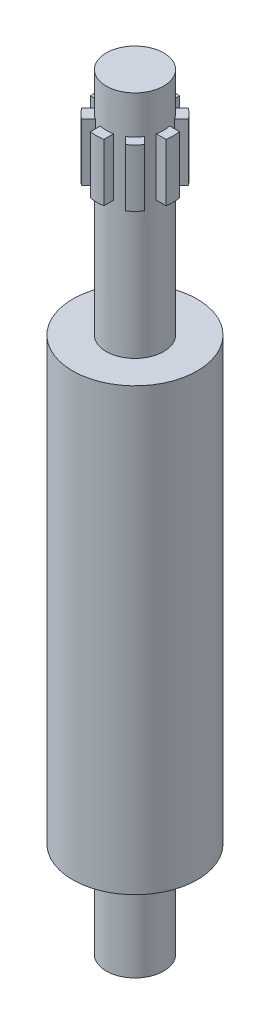
ISO-10303-21;
HEADER;
FILE_DESCRIPTION(('STEP AP214'),'2;1');
FILE_NAME('part.step','',(''),(''),'','','');
FILE_SCHEMA(('AUTOMOTIVE_DESIGN { 1 0 10303 214 1 1 1 1 }'));
ENDSEC;
DATA;
#1=APPLICATION_CONTEXT('core data for automotive mechanical design processes');
#2=APPLICATION_PROTOCOL_DEFINITION('international standard','automotive_design',2000,#1);
#3=PRODUCT_CONTEXT('',#1,'mechanical');
#4=PRODUCT('Part','Part','',(#3));
#5=PRODUCT_RELATED_PRODUCT_CATEGORY('part','',(#4));
#6=PRODUCT_DEFINITION_FORMATION('','',#4);
#7=PRODUCT_DEFINITION_CONTEXT('part definition',#1,'design');
#8=PRODUCT_DEFINITION('design','',#6,#7);
#9=PRODUCT_DEFINITION_SHAPE('','',#8);
#10=(LENGTH_UNIT() NAMED_UNIT(*) SI_UNIT(.MILLI.,.METRE.));
#11=(NAMED_UNIT(*) PLANE_ANGLE_UNIT() SI_UNIT($,.RADIAN.));
#12=(NAMED_UNIT(*) SI_UNIT($,.STERADIAN.) SOLID_ANGLE_UNIT());
#13=UNCERTAINTY_MEASURE_WITH_UNIT(LENGTH_MEASURE(1.E-05),#10,'distance_accuracy_value','');
#14=(GEOMETRIC_REPRESENTATION_CONTEXT(3) GLOBAL_UNCERTAINTY_ASSIGNED_CONTEXT((#13)) GLOBAL_UNIT_ASSIGNED_CONTEXT((#10,
#11,#12)) REPRESENTATION_CONTEXT('',''));
#15=CARTESIAN_POINT('',(0.,0.,0.));
#16=DIRECTION('',(0.,0.,1.));
#17=DIRECTION('',(1.,0.,0.));
#18=AXIS2_PLACEMENT_3D('',#15,#16,#17);
#19=CARTESIAN_POINT('',(0.,330.,0.));
#20=DIRECTION('',(0.,1.,0.));
#21=DIRECTION('',(0.,0.,1.));
#22=AXIS2_PLACEMENT_3D('',#19,#20,#21);
#23=PLANE('',#22);
#24=DIRECTION('',(0.707106781186547,0.,-0.707106781186548));
#25=VECTOR('',#24,1.);
#26=CARTESIAN_POINT('',(-11.4490265814913,330.,16.3987740497974));
#27=LINE('',#26,#25);
#28=CARTESIAN_POINT('',(-11.4490265814913,330.,16.3987740497974));
#29=VERTEX_POINT('',#28);
#30=CARTESIAN_POINT('',(-7.83895193821507,330.,12.7886994065211));
#31=VERTEX_POINT('',#30);
#32=EDGE_CURVE('E623',#29,#31,#27,.T.);
#33=ORIENTED_EDGE('',*,*,#32,.T.);
#34=CARTESIAN_POINT('',(0.,330.,0.));
#35=DIRECTION('',(0.,1.,0.));
#36=DIRECTION('',(0.,0.,1.));
#37=AXIS2_PLACEMENT_3D('',#34,#35,#36);
#38=CIRCLE('',#37,15.);
#39=CARTESIAN_POINT('',(-12.788699406521,330.,7.83895193821537));
#40=VERTEX_POINT('',#39);
#41=EDGE_CURVE('E462',#40,#31,#38,.T.);
#42=ORIENTED_EDGE('',*,*,#41,.F.);
#43=DIRECTION('',(-0.707106781186547,0.,0.707106781186548));
#44=VECTOR('',#43,1.);
#45=CARTESIAN_POINT('',(-12.788699406521,330.,7.83895193821539));
#46=LINE('',#45,#44);
#47=CARTESIAN_POINT('',(-16.3987740497972,330.,11.4490265814916));
#48=VERTEX_POINT('',#47);
#49=EDGE_CURVE('E615',#40,#48,#46,.T.);
#50=ORIENTED_EDGE('',*,*,#49,.T.);
#51=CARTESIAN_POINT('',(0.,330.,0.));
#52=DIRECTION('',(0.,1.,0.));
#53=DIRECTION('',(0.,0.,1.));
#54=AXIS2_PLACEMENT_3D('',#51,#52,#53);
#55=CIRCLE('',#54,20.);
#56=EDGE_CURVE('E619',#48,#29,#55,.T.);
#57=ORIENTED_EDGE('',*,*,#56,.T.);
#58=EDGE_LOOP('',(#33,#42,#50,#57));
#59=FACE_BOUND('',#58,.T.);
#60=ADVANCED_FACE('F43',(#59),#23,.T.);
#61=DIRECTION('',(1.,0.,0.));
#62=VECTOR('',#61,1.);
#63=CARTESIAN_POINT('',(-19.6913686675152,330.,3.50000000000016));
#64=LINE('',#63,#62);
#65=CARTESIAN_POINT('',(-19.6913686675152,330.,3.50000000000015));
#66=VERTEX_POINT('',#65);
#67=CARTESIAN_POINT('',(-14.5859521458148,330.,3.50000000000016));
#68=VERTEX_POINT('',#67);
#69=EDGE_CURVE('E612',#66,#68,#64,.T.);
#70=ORIENTED_EDGE('',*,*,#69,.T.);
#71=CARTESIAN_POINT('',(-14.5859521458149,330.,-3.49999999999984));
#72=VERTEX_POINT('',#71);
#73=EDGE_CURVE('E467',#72,#68,#38,.T.);
#74=ORIENTED_EDGE('',*,*,#73,.F.);
#75=DIRECTION('',(-1.,0.,0.));
#76=VECTOR('',#75,1.);
#77=CARTESIAN_POINT('',(-14.5859521458149,330.,-3.49999999999984));
#78=LINE('',#77,#76);
#79=CARTESIAN_POINT('',(-19.6913686675152,330.,-3.5));
#80=VERTEX_POINT('',#79);
#81=EDGE_CURVE('E604',#72,#80,#78,.T.);
#82=ORIENTED_EDGE('',*,*,#81,.T.);
#83=CARTESIAN_POINT('',(0.,330.,0.));
#84=DIRECTION('',(0.,1.,0.));
#85=DIRECTION('',(0.,0.,1.));
#86=AXIS2_PLACEMENT_3D('',#83,#84,#85);
#87=CIRCLE('',#86,20.);
#88=EDGE_CURVE('E608',#80,#66,#87,.T.);
#89=ORIENTED_EDGE('',*,*,#88,.T.);
#90=EDGE_LOOP('',(#70,#74,#82,#89));
#91=FACE_BOUND('',#90,.T.);
#92=ADVANCED_FACE('F391',(#91),#23,.T.);
#93=DIRECTION('',(0.707106781186548,0.,0.707106781186547));
#94=VECTOR('',#93,1.);
#95=CARTESIAN_POINT('',(-16.3987740497973,330.,-11.4490265814913));
#96=LINE('',#95,#94);
#97=CARTESIAN_POINT('',(-16.3987740497973,330.,-11.4490265814913));
#98=VERTEX_POINT('',#97);
#99=CARTESIAN_POINT('',(-12.7886994065211,330.,-7.83895193821511));
#100=VERTEX_POINT('',#99);
#101=EDGE_CURVE('E601',#98,#100,#96,.T.);
#102=ORIENTED_EDGE('',*,*,#101,.T.);
#103=CARTESIAN_POINT('',(-7.83895193821533,330.,-12.788699406521));
#104=VERTEX_POINT('',#103);
#105=EDGE_CURVE('E473',#104,#100,#38,.T.);
#106=ORIENTED_EDGE('',*,*,#105,.F.);
#107=DIRECTION('',(-0.707106781186548,0.,-0.707106781186547));
#108=VECTOR('',#107,1.);
#109=CARTESIAN_POINT('',(-7.83895193821531,330.,-12.788699406521));
#110=LINE('',#109,#108);
#111=CARTESIAN_POINT('',(-11.4490265814915,330.,-16.3987740497971));
#112=VERTEX_POINT('',#111);
#113=EDGE_CURVE('E505',#104,#112,#110,.T.);
#114=ORIENTED_EDGE('',*,*,#113,.T.);
#115=CARTESIAN_POINT('',(0.,330.,0.));
#116=DIRECTION('',(0.,1.,0.));
#117=DIRECTION('',(0.,0.,1.));
#118=AXIS2_PLACEMENT_3D('',#115,#116,#117);
#119=CIRCLE('',#118,20.);
#120=EDGE_CURVE('E597',#112,#98,#119,.T.);
#121=ORIENTED_EDGE('',*,*,#120,.T.);
#122=EDGE_LOOP('',(#102,#106,#114,#121));
#123=FACE_BOUND('',#122,.T.);
#124=ADVANCED_FACE('F397',(#123),#23,.T.);
#125=DIRECTION('',(0.,0.,1.));
#126=VECTOR('',#125,1.);
#127=CARTESIAN_POINT('',(-3.5,330.,-19.6913686675152));
#128=LINE('',#127,#126);
#129=CARTESIAN_POINT('',(-3.5,330.,-19.6913686675152));
#130=VERTEX_POINT('',#129);
#131=CARTESIAN_POINT('',(-3.5,330.,-14.5859521458148));
#132=VERTEX_POINT('',#131);
#133=EDGE_CURVE('E502',#130,#132,#128,.T.);
#134=ORIENTED_EDGE('',*,*,#133,.T.);
#135=CARTESIAN_POINT('',(3.5,330.,-14.5859521458148));
#136=VERTEX_POINT('',#135);
#137=EDGE_CURVE('E481',#136,#132,#38,.T.);
#138=ORIENTED_EDGE('',*,*,#137,.F.);
#139=DIRECTION('',(0.,0.,-1.));
#140=VECTOR('',#139,1.);
#141=CARTESIAN_POINT('',(3.5,330.,-14.5859521458148));
#142=LINE('',#141,#140);
#143=CARTESIAN_POINT('',(3.5,330.,-19.6913686675152));
#144=VERTEX_POINT('',#143);
#145=EDGE_CURVE('E519',#136,#144,#142,.T.);
#146=ORIENTED_EDGE('',*,*,#145,.T.);
#147=CARTESIAN_POINT('',(0.,330.,0.));
#148=DIRECTION('',(0.,1.,0.));
#149=DIRECTION('',(0.,0.,1.));
#150=AXIS2_PLACEMENT_3D('',#147,#148,#149);
#151=CIRCLE('',#150,20.);
#152=EDGE_CURVE('E456',#144,#130,#151,.T.);
#153=ORIENTED_EDGE('',*,*,#152,.T.);
#154=EDGE_LOOP('',(#134,#138,#146,#153));
#155=FACE_BOUND('',#154,.T.);
#156=ADVANCED_FACE('F503',(#155),#23,.T.);
#157=DIRECTION('',(-0.707106781186547,0.,0.707106781186547));
#158=VECTOR('',#157,1.);
#159=CARTESIAN_POINT('',(11.4490265814914,330.,-16.3987740497973));
#160=LINE('',#159,#158);
#161=CARTESIAN_POINT('',(11.4490265814914,330.,-16.3987740497973));
#162=VERTEX_POINT('',#161);
#163=CARTESIAN_POINT('',(7.83895193821517,330.,-12.7886994065211));
#164=VERTEX_POINT('',#163);
#165=EDGE_CURVE('E661',#162,#164,#160,.T.);
#166=ORIENTED_EDGE('',*,*,#165,.T.);
#167=CARTESIAN_POINT('',(12.788699406521,330.,-7.83895193821526));
#168=VERTEX_POINT('',#167);
#169=EDGE_CURVE('E247',#168,#164,#38,.T.);
#170=ORIENTED_EDGE('',*,*,#169,.F.);
#171=DIRECTION('',(0.707106781186548,0.,-0.707106781186548));
#172=VECTOR('',#171,1.);
#173=CARTESIAN_POINT('',(12.7886994065211,330.,-7.8389519382153));
#174=LINE('',#173,#172);
#175=CARTESIAN_POINT('',(16.3987740497972,330.,-11.4490265814915));
#176=VERTEX_POINT('',#175);
#177=EDGE_CURVE('E653',#168,#176,#174,.T.);
#178=ORIENTED_EDGE('',*,*,#177,.T.);
#179=CARTESIAN_POINT('',(0.,330.,0.));
#180=DIRECTION('',(0.,1.,0.));
#181=DIRECTION('',(0.,0.,1.));
#182=AXIS2_PLACEMENT_3D('',#179,#180,#181);
#183=CIRCLE('',#182,20.);
#184=EDGE_CURVE('E657',#176,#162,#183,.T.);
#185=ORIENTED_EDGE('',*,*,#184,.T.);
#186=EDGE_LOOP('',(#166,#170,#178,#185));
#187=FACE_BOUND('',#186,.T.);
#188=ADVANCED_FACE('F419',(#187),#23,.T.);
#189=DIRECTION('',(-1.,0.,0.));
#190=VECTOR('',#189,1.);
#191=CARTESIAN_POINT('',(19.6913686675153,330.,-3.50000000000006));
#192=LINE('',#191,#190);
#193=CARTESIAN_POINT('',(19.6913686675153,330.,-3.50000000000006));
#194=VERTEX_POINT('',#193);
#195=CARTESIAN_POINT('',(14.5859521458148,330.,-3.50000000000006));
#196=VERTEX_POINT('',#195);
#197=EDGE_CURVE('E649',#194,#196,#192,.T.);
#198=ORIENTED_EDGE('',*,*,#197,.T.);
#199=CARTESIAN_POINT('',(14.5859521458148,330.,3.49999999999994));
#200=VERTEX_POINT('',#199);
#201=EDGE_CURVE('E450',#200,#196,#38,.T.);
#202=ORIENTED_EDGE('',*,*,#201,.F.);
#203=DIRECTION('',(1.,0.,0.));
#204=VECTOR('',#203,1.);
#205=CARTESIAN_POINT('',(14.5859521458149,330.,3.49999999999994));
#206=LINE('',#205,#204);
#207=CARTESIAN_POINT('',(19.6913686675153,330.,3.49999999999994));
#208=VERTEX_POINT('',#207);
#209=EDGE_CURVE('E438',#200,#208,#206,.T.);
#210=ORIENTED_EDGE('',*,*,#209,.T.);
#211=CARTESIAN_POINT('',(0.,330.,0.));
#212=DIRECTION('',(0.,1.,0.));
#213=DIRECTION('',(0.,0.,1.));
#214=AXIS2_PLACEMENT_3D('',#211,#212,#213);
#215=CIRCLE('',#214,20.0000000000001);
#216=EDGE_CURVE('E645',#208,#194,#215,.T.);
#217=ORIENTED_EDGE('',*,*,#216,.T.);
#218=EDGE_LOOP('',(#198,#202,#210,#217));
#219=FACE_BOUND('',#218,.T.);
#220=ADVANCED_FACE('F412',(#219),#23,.T.);
#221=DIRECTION('',(-0.707106781186547,0.,-0.707106781186548));
#222=VECTOR('',#221,1.);
#223=CARTESIAN_POINT('',(16.3987740497974,330.,11.4490265814914));
#224=LINE('',#223,#222);
#225=CARTESIAN_POINT('',(16.3987740497974,330.,11.4490265814914));
#226=VERTEX_POINT('',#225);
#227=CARTESIAN_POINT('',(12.7886994065211,330.,7.83895193821513));
#228=VERTEX_POINT('',#227);
#229=EDGE_CURVE('E426',#226,#228,#224,.T.);
#230=ORIENTED_EDGE('',*,*,#229,.T.);
#231=CARTESIAN_POINT('',(7.83895193821531,330.,12.788699406521));
#232=VERTEX_POINT('',#231);
#233=EDGE_CURVE('E430',#232,#228,#38,.T.);
#234=ORIENTED_EDGE('',*,*,#233,.F.);
#235=DIRECTION('',(0.707106781186547,0.,0.707106781186547));
#236=VECTOR('',#235,1.);
#237=CARTESIAN_POINT('',(7.83895193821538,330.,12.7886994065211));
#238=LINE('',#237,#236);
#239=CARTESIAN_POINT('',(11.4490265814915,330.,16.3987740497972));
#240=VERTEX_POINT('',#239);
#241=EDGE_CURVE('E637',#232,#240,#238,.T.);
#242=ORIENTED_EDGE('',*,*,#241,.T.);
#243=CARTESIAN_POINT('',(0.,330.,0.));
#244=DIRECTION('',(0.,1.,0.));
#245=DIRECTION('',(0.,0.,1.));
#246=AXIS2_PLACEMENT_3D('',#243,#244,#245);
#247=CIRCLE('',#246,20.0000000000001);
#248=EDGE_CURVE('E433',#240,#226,#247,.T.);
#249=ORIENTED_EDGE('',*,*,#248,.T.);
#250=EDGE_LOOP('',(#230,#234,#242,#249));
#251=FACE_BOUND('',#250,.T.);
#252=ADVANCED_FACE('F404',(#251),#23,.T.);
#253=CARTESIAN_POINT('',(0.,230.,0.));
#254=DIRECTION('',(0.,-1.,0.));
#255=DIRECTION('',(0.,0.,-1.));
#256=AXIS2_PLACEMENT_3D('',#253,#254,#255);
#257=CYLINDRICAL_SURFACE('',#256,32.5);
#258=CARTESIAN_POINT('',(0.,230.,0.));
#259=DIRECTION('',(0.,1.,0.));
#260=DIRECTION('',(0.,0.,1.));
#261=AXIS2_PLACEMENT_3D('',#258,#259,#260);
#262=CIRCLE('',#261,32.5);
#263=CARTESIAN_POINT('',(0.,230.,32.5));
#264=VERTEX_POINT('',#263);
#265=EDGE_CURVE('E368',#264,#264,#262,.T.);
#266=ORIENTED_EDGE('',*,*,#265,.F.);
#267=EDGE_LOOP('',(#266));
#268=FACE_BOUND('',#267,.T.);
#269=CARTESIAN_POINT('',(0.,0.,0.));
#270=DIRECTION('',(0.,1.,0.));
#271=DIRECTION('',(0.,0.,1.));
#272=AXIS2_PLACEMENT_3D('',#269,#270,#271);
#273=CIRCLE('',#272,32.5);
#274=CARTESIAN_POINT('',(0.,0.,32.5));
#275=VERTEX_POINT('',#274);
#276=EDGE_CURVE('E359',#275,#275,#273,.T.);
#277=ORIENTED_EDGE('',*,*,#276,.T.);
#278=EDGE_LOOP('',(#277));
#279=FACE_BOUND('',#278,.T.);
#280=ADVANCED_FACE('F45',(#268,#279),#257,.T.);
#281=CARTESIAN_POINT('',(0.,230.,0.));
#282=DIRECTION('',(0.,1.,0.));
#283=DIRECTION('',(0.,0.,1.));
#284=AXIS2_PLACEMENT_3D('',#281,#282,#283);
#285=PLANE('',#284);
#286=CARTESIAN_POINT('',(0.,230.,0.));
#287=DIRECTION('',(0.,1.,0.));
#288=DIRECTION('',(0.,0.,1.));
#289=AXIS2_PLACEMENT_3D('',#286,#287,#288);
#290=CIRCLE('',#289,15.);
#291=CARTESIAN_POINT('',(0.,230.,15.));
#292=VERTEX_POINT('',#291);
#293=EDGE_CURVE('E364',#292,#292,#290,.T.);
#294=ORIENTED_EDGE('',*,*,#293,.F.);
#295=EDGE_LOOP('',(#294));
#296=FACE_BOUND('',#295,.T.);
#297=ORIENTED_EDGE('',*,*,#265,.T.);
#298=EDGE_LOOP('',(#297));
#299=FACE_BOUND('',#298,.T.);
#300=ADVANCED_FACE('F378',(#296,#299),#285,.T.);
#301=CARTESIAN_POINT('',(0.,0.,0.));
#302=DIRECTION('',(0.,1.,0.));
#303=DIRECTION('',(0.,0.,1.));
#304=AXIS2_PLACEMENT_3D('',#301,#302,#303);
#305=PLANE('',#304);
#306=CARTESIAN_POINT('',(0.,0.,0.));
#307=DIRECTION('',(0.,-1.,0.));
#308=DIRECTION('',(0.,0.,-1.));
#309=AXIS2_PLACEMENT_3D('',#306,#307,#308);
#310=CIRCLE('',#309,15.);
#311=CARTESIAN_POINT('',(0.,0.,-15.));
#312=VERTEX_POINT('',#311);
#313=EDGE_CURVE('E360',#312,#312,#310,.T.);
#314=ORIENTED_EDGE('',*,*,#313,.F.);
#315=EDGE_LOOP('',(#314));
#316=FACE_BOUND('',#315,.T.);
#317=ORIENTED_EDGE('',*,*,#276,.F.);
#318=EDGE_LOOP('',(#317));
#319=FACE_BOUND('',#318,.T.);
#320=ADVANCED_FACE('F376',(#316,#319),#305,.F.);
#321=CARTESIAN_POINT('',(0.,330.,0.));
#322=DIRECTION('',(0.,-1.,0.));
#323=DIRECTION('',(0.,0.,-1.));
#324=AXIS2_PLACEMENT_3D('',#321,#322,#323);
#325=CYLINDRICAL_SURFACE('',#324,15.);
#326=DIRECTION('',(0.,1.,0.));
#327=VECTOR('',#326,1.);
#328=CARTESIAN_POINT('',(-3.49999999999986,300.,14.5859521458149));
#329=LINE('',#328,#327);
#330=CARTESIAN_POINT('',(-3.49999999999986,300.,14.5859521458149));
#331=VERTEX_POINT('',#330);
#332=CARTESIAN_POINT('',(-3.49999999999986,330.,14.5859521458149));
#333=VERTEX_POINT('',#332);
#334=EDGE_CURVE('E303',#331,#333,#329,.T.);
#335=ORIENTED_EDGE('',*,*,#334,.T.);
#336=CARTESIAN_POINT('',(3.50000000000014,330.,14.5859521458148));
#337=VERTEX_POINT('',#336);
#338=EDGE_CURVE('E452',#333,#337,#38,.T.);
#339=ORIENTED_EDGE('',*,*,#338,.T.);
#340=DIRECTION('',(0.,1.,0.));
#341=VECTOR('',#340,1.);
#342=CARTESIAN_POINT('',(3.50000000000014,300.,14.5859521458149));
#343=LINE('',#342,#341);
#344=CARTESIAN_POINT('',(3.50000000000014,300.,14.5859521458149));
#345=VERTEX_POINT('',#344);
#346=EDGE_CURVE('E293',#345,#337,#343,.T.);
#347=ORIENTED_EDGE('',*,*,#346,.F.);
#348=CARTESIAN_POINT('',(0.,300.,0.));
#349=DIRECTION('',(0.,1.,0.));
#350=DIRECTION('',(0.,0.,1.));
#351=AXIS2_PLACEMENT_3D('',#348,#349,#350);
#352=CIRCLE('',#351,15.);
#353=EDGE_CURVE('E47',#331,#345,#352,.T.);
#354=ORIENTED_EDGE('',*,*,#353,.F.);
#355=EDGE_LOOP('',(#335,#339,#347,#354));
#356=FACE_BOUND('',#355,.T.);
#357=DIRECTION('',(0.,1.,0.));
#358=VECTOR('',#357,1.);
#359=CARTESIAN_POINT('',(-12.788699406521,300.,7.83895193821539));
#360=LINE('',#359,#358);
#361=CARTESIAN_POINT('',(-12.788699406521,300.,7.83895193821539));
#362=VERTEX_POINT('',#361);
#363=EDGE_CURVE('E317',#362,#40,#360,.T.);
#364=ORIENTED_EDGE('',*,*,#363,.T.);
#365=ORIENTED_EDGE('',*,*,#41,.T.);
#366=DIRECTION('',(0.,1.,0.));
#367=VECTOR('',#366,1.);
#368=CARTESIAN_POINT('',(-7.83895193821513,300.,12.7886994065212));
#369=LINE('',#368,#367);
#370=CARTESIAN_POINT('',(-7.83895193821513,300.,12.7886994065212));
#371=VERTEX_POINT('',#370);
#372=EDGE_CURVE('E307',#371,#31,#369,.T.);
#373=ORIENTED_EDGE('',*,*,#372,.F.);
#374=EDGE_CURVE('E685',#362,#371,#352,.T.);
#375=ORIENTED_EDGE('',*,*,#374,.F.);
#376=EDGE_LOOP('',(#364,#365,#373,#375));
#377=FACE_BOUND('',#376,.T.);
#378=DIRECTION('',(0.,1.,0.));
#379=VECTOR('',#378,1.);
#380=CARTESIAN_POINT('',(-14.5859521458149,300.,-3.49999999999985));
#381=LINE('',#380,#379);
#382=CARTESIAN_POINT('',(-14.5859521458149,300.,-3.49999999999985));
#383=VERTEX_POINT('',#382);
#384=EDGE_CURVE('E331',#383,#72,#381,.T.);
#385=ORIENTED_EDGE('',*,*,#384,.T.);
#386=ORIENTED_EDGE('',*,*,#73,.T.);
#387=DIRECTION('',(0.,1.,0.));
#388=VECTOR('',#387,1.);
#389=CARTESIAN_POINT('',(-14.5859521458148,300.,3.50000000000016));
#390=LINE('',#389,#388);
#391=CARTESIAN_POINT('',(-14.5859521458148,300.,3.50000000000016));
#392=VERTEX_POINT('',#391);
#393=EDGE_CURVE('E321',#392,#68,#390,.T.);
#394=ORIENTED_EDGE('',*,*,#393,.F.);
#395=EDGE_CURVE('E689',#383,#392,#352,.T.);
#396=ORIENTED_EDGE('',*,*,#395,.F.);
#397=EDGE_LOOP('',(#385,#386,#394,#396));
#398=FACE_BOUND('',#397,.T.);
#399=DIRECTION('',(0.,1.,0.));
#400=VECTOR('',#399,1.);
#401=CARTESIAN_POINT('',(-7.83895193821532,300.,-12.788699406521));
#402=LINE('',#401,#400);
#403=CARTESIAN_POINT('',(-7.83895193821532,300.,-12.788699406521));
#404=VERTEX_POINT('',#403);
#405=EDGE_CURVE('E345',#404,#104,#402,.T.);
#406=ORIENTED_EDGE('',*,*,#405,.T.);
#407=ORIENTED_EDGE('',*,*,#105,.T.);
#408=DIRECTION('',(0.,1.,0.));
#409=VECTOR('',#408,1.);
#410=CARTESIAN_POINT('',(-12.7886994065211,300.,-7.83895193821511));
#411=LINE('',#410,#409);
#412=CARTESIAN_POINT('',(-12.7886994065211,300.,-7.83895193821511));
#413=VERTEX_POINT('',#412);
#414=EDGE_CURVE('E335',#413,#100,#411,.T.);
#415=ORIENTED_EDGE('',*,*,#414,.F.);
#416=EDGE_CURVE('E692',#404,#413,#352,.T.);
#417=ORIENTED_EDGE('',*,*,#416,.F.);
#418=EDGE_LOOP('',(#406,#407,#415,#417));
#419=FACE_BOUND('',#418,.T.);
#420=DIRECTION('',(0.,1.,0.));
#421=VECTOR('',#420,1.);
#422=CARTESIAN_POINT('',(3.5,300.,-14.5859521458148));
#423=LINE('',#422,#421);
#424=CARTESIAN_POINT('',(3.5,300.,-14.5859521458148));
#425=VERTEX_POINT('',#424);
#426=EDGE_CURVE('E250',#425,#136,#423,.T.);
#427=ORIENTED_EDGE('',*,*,#426,.T.);
#428=ORIENTED_EDGE('',*,*,#137,.T.);
#429=DIRECTION('',(0.,1.,0.));
#430=VECTOR('',#429,1.);
#431=CARTESIAN_POINT('',(-3.5,300.,-14.5859521458148));
#432=LINE('',#431,#430);
#433=CARTESIAN_POINT('',(-3.5,300.,-14.5859521458148));
#434=VERTEX_POINT('',#433);
#435=EDGE_CURVE('E349',#434,#132,#432,.T.);
#436=ORIENTED_EDGE('',*,*,#435,.F.);
#437=EDGE_CURVE('E233',#425,#434,#352,.T.);
#438=ORIENTED_EDGE('',*,*,#437,.F.);
#439=EDGE_LOOP('',(#427,#428,#436,#438));
#440=FACE_BOUND('',#439,.T.);
#441=DIRECTION('',(0.,1.,0.));
#442=VECTOR('',#441,1.);
#443=CARTESIAN_POINT('',(12.7886994065211,300.,-7.8389519382153));
#444=LINE('',#443,#442);
#445=CARTESIAN_POINT('',(12.7886994065211,300.,-7.8389519382153));
#446=VERTEX_POINT('',#445);
#447=EDGE_CURVE('E262',#446,#168,#444,.T.);
#448=ORIENTED_EDGE('',*,*,#447,.T.);
#449=ORIENTED_EDGE('',*,*,#169,.T.);
#450=DIRECTION('',(0.,1.,0.));
#451=VECTOR('',#450,1.);
#452=CARTESIAN_POINT('',(7.8389519382152,300.,-12.7886994065211));
#453=LINE('',#452,#451);
#454=CARTESIAN_POINT('',(7.8389519382152,300.,-12.7886994065211));
#455=VERTEX_POINT('',#454);
#456=EDGE_CURVE('E238',#455,#164,#453,.T.);
#457=ORIENTED_EDGE('',*,*,#456,.F.);
#458=EDGE_CURVE('E222',#446,#455,#352,.T.);
#459=ORIENTED_EDGE('',*,*,#458,.F.);
#460=EDGE_LOOP('',(#448,#449,#457,#459));
#461=FACE_BOUND('',#460,.T.);
#462=DIRECTION('',(0.,1.,0.));
#463=VECTOR('',#462,1.);
#464=CARTESIAN_POINT('',(14.5859521458149,300.,3.49999999999994));
#465=LINE('',#464,#463);
#466=CARTESIAN_POINT('',(14.5859521458149,300.,3.49999999999994));
#467=VERTEX_POINT('',#466);
#468=EDGE_CURVE('E275',#467,#200,#465,.T.);
#469=ORIENTED_EDGE('',*,*,#468,.T.);
#470=ORIENTED_EDGE('',*,*,#201,.T.);
#471=DIRECTION('',(0.,1.,0.));
#472=VECTOR('',#471,1.);
#473=CARTESIAN_POINT('',(14.5859521458149,300.,-3.50000000000006));
#474=LINE('',#473,#472);
#475=CARTESIAN_POINT('',(14.5859521458149,300.,-3.50000000000006));
#476=VERTEX_POINT('',#475);
#477=EDGE_CURVE('E265',#476,#196,#474,.T.);
#478=ORIENTED_EDGE('',*,*,#477,.F.);
#479=EDGE_CURVE('E54',#467,#476,#352,.T.);
#480=ORIENTED_EDGE('',*,*,#479,.F.);
#481=EDGE_LOOP('',(#469,#470,#478,#480));
#482=FACE_BOUND('',#481,.T.);
#483=ORIENTED_EDGE('',*,*,#233,.T.);
#484=DIRECTION('',(0.,1.,0.));
#485=VECTOR('',#484,1.);
#486=CARTESIAN_POINT('',(12.7886994065212,300.,7.83895193821521));
#487=LINE('',#486,#485);
#488=CARTESIAN_POINT('',(12.7886994065212,300.,7.83895193821521));
#489=VERTEX_POINT('',#488);
#490=EDGE_CURVE('E279',#489,#228,#487,.T.);
#491=ORIENTED_EDGE('',*,*,#490,.F.);
#492=CARTESIAN_POINT('',(7.83895193821538,300.,12.7886994065211));
#493=VERTEX_POINT('',#492);
#494=EDGE_CURVE('E11',#493,#489,#352,.T.);
#495=ORIENTED_EDGE('',*,*,#494,.F.);
#496=DIRECTION('',(0.,1.,0.));
#497=VECTOR('',#496,1.);
#498=CARTESIAN_POINT('',(7.83895193821538,300.,12.7886994065211));
#499=LINE('',#498,#497);
#500=EDGE_CURVE('E289',#493,#232,#499,.T.);
#501=ORIENTED_EDGE('',*,*,#500,.T.);
#502=EDGE_LOOP('',(#483,#491,#495,#501));
#503=FACE_BOUND('',#502,.T.);
#504=ORIENTED_EDGE('',*,*,#293,.T.);
#505=EDGE_LOOP('',(#504));
#506=FACE_BOUND('',#505,.T.);
#507=CARTESIAN_POINT('',(0.,350.,0.));
#508=DIRECTION('',(0.,1.,0.));
#509=DIRECTION('',(0.,0.,1.));
#510=AXIS2_PLACEMENT_3D('',#507,#508,#509);
#511=CIRCLE('',#510,15.);
#512=CARTESIAN_POINT('',(0.,350.,15.));
#513=VERTEX_POINT('',#512);
#514=EDGE_CURVE('E449',#513,#513,#511,.T.);
#515=ORIENTED_EDGE('',*,*,#514,.F.);
#516=EDGE_LOOP('',(#515));
#517=FACE_BOUND('',#516,.T.);
#518=ADVANCED_FACE('F244',(#356,#377,#398,#419,#440,#461,#482,#503,#506,#517),#325,.T.);
#519=DIRECTION('',(0.,0.,-1.));
#520=VECTOR('',#519,1.);
#521=CARTESIAN_POINT('',(3.50000000000014,330.,19.6913686675153));
#522=LINE('',#521,#520);
#523=CARTESIAN_POINT('',(3.50000000000015,330.,19.6913686675153));
#524=VERTEX_POINT('',#523);
#525=EDGE_CURVE('E634',#524,#337,#522,.T.);
#526=ORIENTED_EDGE('',*,*,#525,.T.);
#527=ORIENTED_EDGE('',*,*,#338,.F.);
#528=DIRECTION('',(0.,0.,1.));
#529=VECTOR('',#528,1.);
#530=CARTESIAN_POINT('',(-3.49999999999986,330.,14.5859521458149));
#531=LINE('',#530,#529);
#532=CARTESIAN_POINT('',(-3.49999999999985,330.,19.6913686675153));
#533=VERTEX_POINT('',#532);
#534=EDGE_CURVE('E626',#333,#533,#531,.T.);
#535=ORIENTED_EDGE('',*,*,#534,.T.);
#536=CARTESIAN_POINT('',(0.,330.,0.));
#537=DIRECTION('',(0.,1.,0.));
#538=DIRECTION('',(0.,0.,1.));
#539=AXIS2_PLACEMENT_3D('',#536,#537,#538);
#540=CIRCLE('',#539,20.0000000000001);
#541=EDGE_CURVE('E630',#533,#524,#540,.T.);
#542=ORIENTED_EDGE('',*,*,#541,.T.);
#543=EDGE_LOOP('',(#526,#527,#535,#542));
#544=FACE_BOUND('',#543,.T.);
#545=ADVANCED_FACE('F384',(#544),#23,.T.);
#546=CARTESIAN_POINT('',(0.,-50.,0.));
#547=DIRECTION('',(0.,1.,0.));
#548=DIRECTION('',(0.,0.,1.));
#549=AXIS2_PLACEMENT_3D('',#546,#547,#548);
#550=CYLINDRICAL_SURFACE('',#549,15.);
#551=CARTESIAN_POINT('',(0.,-50.,0.));
#552=DIRECTION('',(0.,-1.,0.));
#553=DIRECTION('',(0.,0.,-1.));
#554=AXIS2_PLACEMENT_3D('',#551,#552,#553);
#555=CIRCLE('',#554,15.);
#556=CARTESIAN_POINT('',(0.,-50.,-15.));
#557=VERTEX_POINT('',#556);
#558=EDGE_CURVE('E355',#557,#557,#555,.T.);
#559=ORIENTED_EDGE('',*,*,#558,.F.);
#560=EDGE_LOOP('',(#559));
#561=FACE_BOUND('',#560,.T.);
#562=ORIENTED_EDGE('',*,*,#313,.T.);
#563=EDGE_LOOP('',(#562));
#564=FACE_BOUND('',#563,.T.);
#565=ADVANCED_FACE('F402',(#561,#564),#550,.T.);
#566=CARTESIAN_POINT('',(0.,-50.,0.));
#567=DIRECTION('',(0.,-1.,0.));
#568=DIRECTION('',(0.,0.,-1.));
#569=AXIS2_PLACEMENT_3D('',#566,#567,#568);
#570=PLANE('',#569);
#571=ORIENTED_EDGE('',*,*,#558,.T.);
#572=EDGE_LOOP('',(#571));
#573=FACE_BOUND('',#572,.T.);
#574=ADVANCED_FACE('F408',(#573),#570,.T.);
#575=CARTESIAN_POINT('',(0.,300.,0.));
#576=DIRECTION('',(0.,1.,0.));
#577=DIRECTION('',(0.,0.,1.));
#578=AXIS2_PLACEMENT_3D('',#575,#576,#577);
#579=CYLINDRICAL_SURFACE('',#578,20.0000000000001);
#580=ORIENTED_EDGE('',*,*,#541,.F.);
#581=DIRECTION('',(0.,1.,0.));
#582=VECTOR('',#581,1.);
#583=CARTESIAN_POINT('',(-3.49999999999985,300.,19.6913686675153));
#584=LINE('',#583,#582);
#585=CARTESIAN_POINT('',(-3.49999999999985,300.,19.6913686675153));
#586=VERTEX_POINT('',#585);
#587=EDGE_CURVE('E300',#586,#533,#584,.T.);
#588=ORIENTED_EDGE('',*,*,#587,.F.);
#589=CARTESIAN_POINT('',(0.,300.,0.));
#590=DIRECTION('',(0.,1.,0.));
#591=DIRECTION('',(0.,0.,1.));
#592=AXIS2_PLACEMENT_3D('',#589,#590,#591);
#593=CIRCLE('',#592,20.0000000000001);
#594=CARTESIAN_POINT('',(3.50000000000015,300.,19.6913686675153));
#595=VERTEX_POINT('',#594);
#596=EDGE_CURVE('E556',#586,#595,#593,.T.);
#597=ORIENTED_EDGE('',*,*,#596,.T.);
#598=DIRECTION('',(0.,1.,0.));
#599=VECTOR('',#598,1.);
#600=CARTESIAN_POINT('',(3.50000000000015,300.,19.6913686675153));
#601=LINE('',#600,#599);
#602=EDGE_CURVE('E297',#595,#524,#601,.T.);
#603=ORIENTED_EDGE('',*,*,#602,.T.);
#604=EDGE_LOOP('',(#580,#588,#597,#603));
#605=FACE_BOUND('',#604,.T.);
#606=ADVANCED_FACE('F758',(#605),#579,.T.);
#607=CARTESIAN_POINT('',(0.,300.,0.));
#608=DIRECTION('',(0.,1.,0.));
#609=DIRECTION('',(0.,0.,1.));
#610=AXIS2_PLACEMENT_3D('',#607,#608,#609);
#611=PLANE('',#610);
#612=DIRECTION('',(0.,0.,1.));
#613=VECTOR('',#612,1.);
#614=CARTESIAN_POINT('',(-3.49999999999986,300.,14.5859521458149));
#615=LINE('',#614,#613);
#616=EDGE_CURVE('E552',#331,#586,#615,.T.);
#617=ORIENTED_EDGE('',*,*,#616,.F.);
#618=ORIENTED_EDGE('',*,*,#353,.T.);
#619=DIRECTION('',(0.,0.,-1.));
#620=VECTOR('',#619,1.);
#621=CARTESIAN_POINT('',(3.50000000000014,300.,19.6913686675153));
#622=LINE('',#621,#620);
#623=EDGE_CURVE('E560',#595,#345,#622,.T.);
#624=ORIENTED_EDGE('',*,*,#623,.F.);
#625=ORIENTED_EDGE('',*,*,#596,.F.);
#626=EDGE_LOOP('',(#617,#618,#624,#625));
#627=FACE_BOUND('',#626,.T.);
#628=ADVANCED_FACE('F697',(#627),#611,.F.);
#629=CARTESIAN_POINT('',(-3.49999999999986,300.,14.5859521458149));
#630=DIRECTION('',(-1.,0.,0.));
#631=DIRECTION('',(0.,0.,1.));
#632=AXIS2_PLACEMENT_3D('',#629,#630,#631);
#633=PLANE('',#632);
#634=ORIENTED_EDGE('',*,*,#534,.F.);
#635=ORIENTED_EDGE('',*,*,#334,.F.);
#636=ORIENTED_EDGE('',*,*,#616,.T.);
#637=ORIENTED_EDGE('',*,*,#587,.T.);
#638=EDGE_LOOP('',(#634,#635,#636,#637));
#639=FACE_BOUND('',#638,.T.);
#640=ADVANCED_FACE('F704',(#639),#633,.T.);
#641=CARTESIAN_POINT('',(3.50000000000014,300.,19.6913686675153));
#642=DIRECTION('',(1.,0.,0.));
#643=DIRECTION('',(0.,0.,-1.));
#644=AXIS2_PLACEMENT_3D('',#641,#642,#643);
#645=PLANE('',#644);
#646=ORIENTED_EDGE('',*,*,#525,.F.);
#647=ORIENTED_EDGE('',*,*,#602,.F.);
#648=ORIENTED_EDGE('',*,*,#623,.T.);
#649=ORIENTED_EDGE('',*,*,#346,.T.);
#650=EDGE_LOOP('',(#646,#647,#648,#649));
#651=FACE_BOUND('',#650,.T.);
#652=ADVANCED_FACE('F701',(#651),#645,.T.);
#653=CARTESIAN_POINT('',(0.,300.,0.));
#654=DIRECTION('',(0.,1.,0.));
#655=DIRECTION('',(0.,0.,1.));
#656=AXIS2_PLACEMENT_3D('',#653,#654,#655);
#657=CYLINDRICAL_SURFACE('',#656,20.);
#658=ORIENTED_EDGE('',*,*,#56,.F.);
#659=DIRECTION('',(0.,1.,0.));
#660=VECTOR('',#659,1.);
#661=CARTESIAN_POINT('',(-16.3987740497972,300.,11.4490265814916));
#662=LINE('',#661,#660);
#663=CARTESIAN_POINT('',(-16.3987740497972,300.,11.4490265814916));
#664=VERTEX_POINT('',#663);
#665=EDGE_CURVE('E314',#664,#48,#662,.T.);
#666=ORIENTED_EDGE('',*,*,#665,.F.);
#667=CARTESIAN_POINT('',(0.,300.,0.));
#668=DIRECTION('',(0.,1.,0.));
#669=DIRECTION('',(0.,0.,1.));
#670=AXIS2_PLACEMENT_3D('',#667,#668,#669);
#671=CIRCLE('',#670,20.);
#672=CARTESIAN_POINT('',(-11.4490265814913,300.,16.3987740497974));
#673=VERTEX_POINT('',#672);
#674=EDGE_CURVE('E544',#664,#673,#671,.T.);
#675=ORIENTED_EDGE('',*,*,#674,.T.);
#676=DIRECTION('',(0.,1.,0.));
#677=VECTOR('',#676,1.);
#678=CARTESIAN_POINT('',(-11.4490265814913,300.,16.3987740497974));
#679=LINE('',#678,#677);
#680=EDGE_CURVE('E311',#673,#29,#679,.T.);
#681=ORIENTED_EDGE('',*,*,#680,.T.);
#682=EDGE_LOOP('',(#658,#666,#675,#681));
#683=FACE_BOUND('',#682,.T.);
#684=ADVANCED_FACE('F757',(#683),#657,.T.);
#685=DIRECTION('',(-0.707106781186547,0.,0.707106781186548));
#686=VECTOR('',#685,1.);
#687=CARTESIAN_POINT('',(-12.788699406521,300.,7.83895193821539));
#688=LINE('',#687,#686);
#689=EDGE_CURVE('E540',#362,#664,#688,.T.);
#690=ORIENTED_EDGE('',*,*,#689,.F.);
#691=ORIENTED_EDGE('',*,*,#374,.T.);
#692=DIRECTION('',(0.707106781186547,0.,-0.707106781186548));
#693=VECTOR('',#692,1.);
#694=CARTESIAN_POINT('',(-11.4490265814913,300.,16.3987740497974));
#695=LINE('',#694,#693);
#696=EDGE_CURVE('E548',#673,#371,#695,.T.);
#697=ORIENTED_EDGE('',*,*,#696,.F.);
#698=ORIENTED_EDGE('',*,*,#674,.F.);
#699=EDGE_LOOP('',(#690,#691,#697,#698));
#700=FACE_BOUND('',#699,.T.);
#701=ADVANCED_FACE('F771',(#700),#611,.F.);
#702=CARTESIAN_POINT('',(-12.788699406521,300.,7.83895193821539));
#703=DIRECTION('',(-0.707106781186548,0.,-0.707106781186547));
#704=DIRECTION('',(-0.707106781186547,0.,0.707106781186548));
#705=AXIS2_PLACEMENT_3D('',#702,#703,#704);
#706=PLANE('',#705);
#707=ORIENTED_EDGE('',*,*,#49,.F.);
#708=ORIENTED_EDGE('',*,*,#363,.F.);
#709=ORIENTED_EDGE('',*,*,#689,.T.);
#710=ORIENTED_EDGE('',*,*,#665,.T.);
#711=EDGE_LOOP('',(#707,#708,#709,#710));
#712=FACE_BOUND('',#711,.T.);
#713=ADVANCED_FACE('F681',(#712),#706,.T.);
#714=CARTESIAN_POINT('',(-11.4490265814913,300.,16.3987740497974));
#715=DIRECTION('',(0.707106781186548,0.,0.707106781186547));
#716=DIRECTION('',(0.707106781186547,0.,-0.707106781186548));
#717=AXIS2_PLACEMENT_3D('',#714,#715,#716);
#718=PLANE('',#717);
#719=ORIENTED_EDGE('',*,*,#32,.F.);
#720=ORIENTED_EDGE('',*,*,#680,.F.);
#721=ORIENTED_EDGE('',*,*,#696,.T.);
#722=ORIENTED_EDGE('',*,*,#372,.T.);
#723=EDGE_LOOP('',(#719,#720,#721,#722));
#724=FACE_BOUND('',#723,.T.);
#725=ADVANCED_FACE('F764',(#724),#718,.T.);
#726=CARTESIAN_POINT('',(0.,300.,0.));
#727=DIRECTION('',(0.,1.,0.));
#728=DIRECTION('',(0.,0.,1.));
#729=AXIS2_PLACEMENT_3D('',#726,#727,#728);
#730=CYLINDRICAL_SURFACE('',#729,20.);
#731=ORIENTED_EDGE('',*,*,#88,.F.);
#732=DIRECTION('',(0.,1.,0.));
#733=VECTOR('',#732,1.);
#734=CARTESIAN_POINT('',(-19.6913686675152,300.,-3.5));
#735=LINE('',#734,#733);
#736=CARTESIAN_POINT('',(-19.6913686675152,300.,-3.5));
#737=VERTEX_POINT('',#736);
#738=EDGE_CURVE('E328',#737,#80,#735,.T.);
#739=ORIENTED_EDGE('',*,*,#738,.F.);
#740=CARTESIAN_POINT('',(0.,300.,0.));
#741=DIRECTION('',(0.,1.,0.));
#742=DIRECTION('',(0.,0.,1.));
#743=AXIS2_PLACEMENT_3D('',#740,#741,#742);
#744=CIRCLE('',#743,20.);
#745=CARTESIAN_POINT('',(-19.6913686675152,300.,3.50000000000015));
#746=VERTEX_POINT('',#745);
#747=EDGE_CURVE('E532',#737,#746,#744,.T.);
#748=ORIENTED_EDGE('',*,*,#747,.T.);
#749=DIRECTION('',(0.,1.,0.));
#750=VECTOR('',#749,1.);
#751=CARTESIAN_POINT('',(-19.6913686675152,300.,3.50000000000015));
#752=LINE('',#751,#750);
#753=EDGE_CURVE('E325',#746,#66,#752,.T.);
#754=ORIENTED_EDGE('',*,*,#753,.T.);
#755=EDGE_LOOP('',(#731,#739,#748,#754));
#756=FACE_BOUND('',#755,.T.);
#757=ADVANCED_FACE('F767',(#756),#730,.T.);
#758=DIRECTION('',(-1.,0.,0.));
#759=VECTOR('',#758,1.);
#760=CARTESIAN_POINT('',(-14.5859521458149,300.,-3.49999999999984));
#761=LINE('',#760,#759);
#762=EDGE_CURVE('E528',#383,#737,#761,.T.);
#763=ORIENTED_EDGE('',*,*,#762,.F.);
#764=ORIENTED_EDGE('',*,*,#395,.T.);
#765=DIRECTION('',(1.,0.,0.));
#766=VECTOR('',#765,1.);
#767=CARTESIAN_POINT('',(-19.6913686675152,300.,3.50000000000016));
#768=LINE('',#767,#766);
#769=EDGE_CURVE('E536',#746,#392,#768,.T.);
#770=ORIENTED_EDGE('',*,*,#769,.F.);
#771=ORIENTED_EDGE('',*,*,#747,.F.);
#772=EDGE_LOOP('',(#763,#764,#770,#771));
#773=FACE_BOUND('',#772,.T.);
#774=ADVANCED_FACE('F783',(#773),#611,.F.);
#775=CARTESIAN_POINT('',(-14.5859521458149,300.,-3.49999999999984));
#776=DIRECTION('',(0.,0.,-1.));
#777=DIRECTION('',(-1.,0.,0.));
#778=AXIS2_PLACEMENT_3D('',#775,#776,#777);
#779=PLANE('',#778);
#780=ORIENTED_EDGE('',*,*,#81,.F.);
#781=ORIENTED_EDGE('',*,*,#384,.F.);
#782=ORIENTED_EDGE('',*,*,#762,.T.);
#783=ORIENTED_EDGE('',*,*,#738,.T.);
#784=EDGE_LOOP('',(#780,#781,#782,#783));
#785=FACE_BOUND('',#784,.T.);
#786=ADVANCED_FACE('F779',(#785),#779,.T.);
#787=CARTESIAN_POINT('',(-19.6913686675152,300.,3.50000000000016));
#788=DIRECTION('',(0.,0.,1.));
#789=DIRECTION('',(1.,0.,0.));
#790=AXIS2_PLACEMENT_3D('',#787,#788,#789);
#791=PLANE('',#790);
#792=ORIENTED_EDGE('',*,*,#69,.F.);
#793=ORIENTED_EDGE('',*,*,#753,.F.);
#794=ORIENTED_EDGE('',*,*,#769,.T.);
#795=ORIENTED_EDGE('',*,*,#393,.T.);
#796=EDGE_LOOP('',(#792,#793,#794,#795));
#797=FACE_BOUND('',#796,.T.);
#798=ADVANCED_FACE('F775',(#797),#791,.T.);
#799=CARTESIAN_POINT('',(0.,300.,0.));
#800=DIRECTION('',(0.,1.,0.));
#801=DIRECTION('',(0.,0.,1.));
#802=AXIS2_PLACEMENT_3D('',#799,#800,#801);
#803=CYLINDRICAL_SURFACE('',#802,20.);
#804=ORIENTED_EDGE('',*,*,#120,.F.);
#805=DIRECTION('',(0.,1.,0.));
#806=VECTOR('',#805,1.);
#807=CARTESIAN_POINT('',(-11.4490265814915,300.,-16.3987740497971));
#808=LINE('',#807,#806);
#809=CARTESIAN_POINT('',(-11.4490265814915,300.,-16.3987740497971));
#810=VERTEX_POINT('',#809);
#811=EDGE_CURVE('E342',#810,#112,#808,.T.);
#812=ORIENTED_EDGE('',*,*,#811,.F.);
#813=CARTESIAN_POINT('',(0.,300.,0.));
#814=DIRECTION('',(0.,1.,0.));
#815=DIRECTION('',(0.,0.,1.));
#816=AXIS2_PLACEMENT_3D('',#813,#814,#815);
#817=CIRCLE('',#816,20.);
#818=CARTESIAN_POINT('',(-16.3987740497973,300.,-11.4490265814913));
#819=VERTEX_POINT('',#818);
#820=EDGE_CURVE('E517',#810,#819,#817,.T.);
#821=ORIENTED_EDGE('',*,*,#820,.T.);
#822=DIRECTION('',(0.,1.,0.));
#823=VECTOR('',#822,1.);
#824=CARTESIAN_POINT('',(-16.3987740497973,300.,-11.4490265814913));
#825=LINE('',#824,#823);
#826=EDGE_CURVE('E339',#819,#98,#825,.T.);
#827=ORIENTED_EDGE('',*,*,#826,.T.);
#828=EDGE_LOOP('',(#804,#812,#821,#827));
#829=FACE_BOUND('',#828,.T.);
#830=ADVANCED_FACE('F778',(#829),#803,.T.);
#831=DIRECTION('',(-0.707106781186548,0.,-0.707106781186547));
#832=VECTOR('',#831,1.);
#833=CARTESIAN_POINT('',(-7.83895193821531,300.,-12.788699406521));
#834=LINE('',#833,#832);
#835=EDGE_CURVE('E511',#404,#810,#834,.T.);
#836=ORIENTED_EDGE('',*,*,#835,.F.);
#837=ORIENTED_EDGE('',*,*,#416,.T.);
#838=DIRECTION('',(0.707106781186548,0.,0.707106781186547));
#839=VECTOR('',#838,1.);
#840=CARTESIAN_POINT('',(-16.3987740497973,300.,-11.4490265814913));
#841=LINE('',#840,#839);
#842=EDGE_CURVE('E524',#819,#413,#841,.T.);
#843=ORIENTED_EDGE('',*,*,#842,.F.);
#844=ORIENTED_EDGE('',*,*,#820,.F.);
#845=EDGE_LOOP('',(#836,#837,#843,#844));
#846=FACE_BOUND('',#845,.T.);
#847=ADVANCED_FACE('F796',(#846),#611,.F.);
#848=CARTESIAN_POINT('',(-7.83895193821531,300.,-12.788699406521));
#849=DIRECTION('',(0.707106781186547,0.,-0.707106781186548));
#850=DIRECTION('',(-0.707106781186548,0.,-0.707106781186547));
#851=AXIS2_PLACEMENT_3D('',#848,#849,#850);
#852=PLANE('',#851);
#853=ORIENTED_EDGE('',*,*,#113,.F.);
#854=ORIENTED_EDGE('',*,*,#405,.F.);
#855=ORIENTED_EDGE('',*,*,#835,.T.);
#856=ORIENTED_EDGE('',*,*,#811,.T.);
#857=EDGE_LOOP('',(#853,#854,#855,#856));
#858=FACE_BOUND('',#857,.T.);
#859=ADVANCED_FACE('F792',(#858),#852,.T.);
#860=CARTESIAN_POINT('',(-16.3987740497973,300.,-11.4490265814913));
#861=DIRECTION('',(-0.707106781186547,0.,0.707106781186548));
#862=DIRECTION('',(0.707106781186548,0.,0.707106781186547));
#863=AXIS2_PLACEMENT_3D('',#860,#861,#862);
#864=PLANE('',#863);
#865=ORIENTED_EDGE('',*,*,#101,.F.);
#866=ORIENTED_EDGE('',*,*,#826,.F.);
#867=ORIENTED_EDGE('',*,*,#842,.T.);
#868=ORIENTED_EDGE('',*,*,#414,.T.);
#869=EDGE_LOOP('',(#865,#866,#867,#868));
#870=FACE_BOUND('',#869,.T.);
#871=ADVANCED_FACE('F788',(#870),#864,.T.);
#872=CARTESIAN_POINT('',(0.,300.,0.));
#873=DIRECTION('',(0.,1.,0.));
#874=DIRECTION('',(0.,0.,1.));
#875=AXIS2_PLACEMENT_3D('',#872,#873,#874);
#876=CYLINDRICAL_SURFACE('',#875,20.);
#877=ORIENTED_EDGE('',*,*,#152,.F.);
#878=DIRECTION('',(0.,1.,0.));
#879=VECTOR('',#878,1.);
#880=CARTESIAN_POINT('',(3.5,300.,-19.6913686675152));
#881=LINE('',#880,#879);
#882=CARTESIAN_POINT('',(3.5,300.,-19.6913686675152));
#883=VERTEX_POINT('',#882);
#884=EDGE_CURVE('E62',#883,#144,#881,.T.);
#885=ORIENTED_EDGE('',*,*,#884,.F.);
#886=CARTESIAN_POINT('',(0.,300.,0.));
#887=DIRECTION('',(0.,1.,0.));
#888=DIRECTION('',(0.,0.,1.));
#889=AXIS2_PLACEMENT_3D('',#886,#887,#888);
#890=CIRCLE('',#889,20.);
#891=CARTESIAN_POINT('',(-3.5,300.,-19.6913686675152));
#892=VERTEX_POINT('',#891);
#893=EDGE_CURVE('E512',#883,#892,#890,.T.);
#894=ORIENTED_EDGE('',*,*,#893,.T.);
#895=DIRECTION('',(0.,1.,0.));
#896=VECTOR('',#895,1.);
#897=CARTESIAN_POINT('',(-3.5,300.,-19.6913686675152));
#898=LINE('',#897,#896);
#899=EDGE_CURVE('E132',#892,#130,#898,.T.);
#900=ORIENTED_EDGE('',*,*,#899,.T.);
#901=EDGE_LOOP('',(#877,#885,#894,#900));
#902=FACE_BOUND('',#901,.T.);
#903=ADVANCED_FACE('F791',(#902),#876,.T.);
#904=DIRECTION('',(0.,0.,-1.));
#905=VECTOR('',#904,1.);
#906=CARTESIAN_POINT('',(3.5,300.,-14.5859521458148));
#907=LINE('',#906,#905);
#908=EDGE_CURVE('E240',#425,#883,#907,.T.);
#909=ORIENTED_EDGE('',*,*,#908,.F.);
#910=ORIENTED_EDGE('',*,*,#437,.T.);
#911=DIRECTION('',(0.,0.,1.));
#912=VECTOR('',#911,1.);
#913=CARTESIAN_POINT('',(-3.5,300.,-19.6913686675152));
#914=LINE('',#913,#912);
#915=EDGE_CURVE('E508',#892,#434,#914,.T.);
#916=ORIENTED_EDGE('',*,*,#915,.F.);
#917=ORIENTED_EDGE('',*,*,#893,.F.);
#918=EDGE_LOOP('',(#909,#910,#916,#917));
#919=FACE_BOUND('',#918,.T.);
#920=ADVANCED_FACE('F724',(#919),#611,.F.);
#921=CARTESIAN_POINT('',(-3.5,300.,-19.6913686675152));
#922=DIRECTION('',(-1.,0.,0.));
#923=DIRECTION('',(0.,0.,1.));
#924=AXIS2_PLACEMENT_3D('',#921,#922,#923);
#925=PLANE('',#924);
#926=ORIENTED_EDGE('',*,*,#133,.F.);
#927=ORIENTED_EDGE('',*,*,#899,.F.);
#928=ORIENTED_EDGE('',*,*,#915,.T.);
#929=ORIENTED_EDGE('',*,*,#435,.T.);
#930=EDGE_LOOP('',(#926,#927,#928,#929));
#931=FACE_BOUND('',#930,.T.);
#932=ADVANCED_FACE('F507',(#931),#925,.T.);
#933=CARTESIAN_POINT('',(3.5,300.,-14.5859521458148));
#934=DIRECTION('',(1.,0.,0.));
#935=DIRECTION('',(0.,0.,-1.));
#936=AXIS2_PLACEMENT_3D('',#933,#934,#935);
#937=PLANE('',#936);
#938=ORIENTED_EDGE('',*,*,#145,.F.);
#939=ORIENTED_EDGE('',*,*,#426,.F.);
#940=ORIENTED_EDGE('',*,*,#908,.T.);
#941=ORIENTED_EDGE('',*,*,#884,.T.);
#942=EDGE_LOOP('',(#938,#939,#940,#941));
#943=FACE_BOUND('',#942,.T.);
#944=ADVANCED_FACE('F666',(#943),#937,.T.);
#945=CARTESIAN_POINT('',(0.,300.,0.));
#946=DIRECTION('',(0.,1.,0.));
#947=DIRECTION('',(0.,0.,1.));
#948=AXIS2_PLACEMENT_3D('',#945,#946,#947);
#949=CYLINDRICAL_SURFACE('',#948,20.);
#950=ORIENTED_EDGE('',*,*,#184,.F.);
#951=DIRECTION('',(0.,1.,0.));
#952=VECTOR('',#951,1.);
#953=CARTESIAN_POINT('',(16.3987740497972,300.,-11.4490265814915));
#954=LINE('',#953,#952);
#955=CARTESIAN_POINT('',(16.3987740497972,300.,-11.4490265814915));
#956=VERTEX_POINT('',#955);
#957=EDGE_CURVE('E256',#956,#176,#954,.T.);
#958=ORIENTED_EDGE('',*,*,#957,.F.);
#959=CARTESIAN_POINT('',(0.,300.,0.));
#960=DIRECTION('',(0.,1.,0.));
#961=DIRECTION('',(0.,0.,1.));
#962=AXIS2_PLACEMENT_3D('',#959,#960,#961);
#963=CIRCLE('',#962,20.);
#964=CARTESIAN_POINT('',(11.4490265814914,300.,-16.3987740497973));
#965=VERTEX_POINT('',#964);
#966=EDGE_CURVE('E241',#956,#965,#963,.T.);
#967=ORIENTED_EDGE('',*,*,#966,.T.);
#968=DIRECTION('',(0.,1.,0.));
#969=VECTOR('',#968,1.);
#970=CARTESIAN_POINT('',(11.4490265814914,300.,-16.3987740497973));
#971=LINE('',#970,#969);
#972=EDGE_CURVE('E120',#965,#162,#971,.T.);
#973=ORIENTED_EDGE('',*,*,#972,.T.);
#974=EDGE_LOOP('',(#950,#958,#967,#973));
#975=FACE_BOUND('',#974,.T.);
#976=ADVANCED_FACE('F716',(#975),#949,.T.);
#977=DIRECTION('',(0.707106781186548,0.,-0.707106781186548));
#978=VECTOR('',#977,1.);
#979=CARTESIAN_POINT('',(12.7886994065211,300.,-7.8389519382153));
#980=LINE('',#979,#978);
#981=EDGE_CURVE('E228',#446,#956,#980,.T.);
#982=ORIENTED_EDGE('',*,*,#981,.F.);
#983=ORIENTED_EDGE('',*,*,#458,.T.);
#984=DIRECTION('',(-0.707106781186547,0.,0.707106781186547));
#985=VECTOR('',#984,1.);
#986=CARTESIAN_POINT('',(11.4490265814914,300.,-16.3987740497973));
#987=LINE('',#986,#985);
#988=EDGE_CURVE('E226',#965,#455,#987,.T.);
#989=ORIENTED_EDGE('',*,*,#988,.F.);
#990=ORIENTED_EDGE('',*,*,#966,.F.);
#991=EDGE_LOOP('',(#982,#983,#989,#990));
#992=FACE_BOUND('',#991,.T.);
#993=ADVANCED_FACE('F224',(#992),#611,.F.);
#994=CARTESIAN_POINT('',(12.7886994065211,300.,-7.8389519382153));
#995=DIRECTION('',(0.707106781186547,0.,0.707106781186547));
#996=DIRECTION('',(0.707106781186548,0.,-0.707106781186548));
#997=AXIS2_PLACEMENT_3D('',#994,#995,#996);
#998=PLANE('',#997);
#999=ORIENTED_EDGE('',*,*,#177,.F.);
#1000=ORIENTED_EDGE('',*,*,#447,.F.);
#1001=ORIENTED_EDGE('',*,*,#981,.T.);
#1002=ORIENTED_EDGE('',*,*,#957,.T.);
#1003=EDGE_LOOP('',(#999,#1000,#1001,#1002));
#1004=FACE_BOUND('',#1003,.T.);
#1005=ADVANCED_FACE('F715',(#1004),#998,.T.);
#1006=CARTESIAN_POINT('',(11.4490265814914,300.,-16.3987740497973));
#1007=DIRECTION('',(-0.707106781186547,0.,-0.707106781186547));
#1008=DIRECTION('',(-0.707106781186548,0.,0.707106781186548));
#1009=AXIS2_PLACEMENT_3D('',#1006,#1007,#1008);
#1010=PLANE('',#1009);
#1011=ORIENTED_EDGE('',*,*,#165,.F.);
#1012=ORIENTED_EDGE('',*,*,#972,.F.);
#1013=ORIENTED_EDGE('',*,*,#988,.T.);
#1014=ORIENTED_EDGE('',*,*,#456,.T.);
#1015=EDGE_LOOP('',(#1011,#1012,#1013,#1014));
#1016=FACE_BOUND('',#1015,.T.);
#1017=ADVANCED_FACE('F236',(#1016),#1010,.T.);
#1018=CARTESIAN_POINT('',(0.,300.,0.));
#1019=DIRECTION('',(0.,1.,0.));
#1020=DIRECTION('',(0.,0.,1.));
#1021=AXIS2_PLACEMENT_3D('',#1018,#1019,#1020);
#1022=CYLINDRICAL_SURFACE('',#1021,20.0000000000001);
#1023=ORIENTED_EDGE('',*,*,#216,.F.);
#1024=DIRECTION('',(0.,1.,0.));
#1025=VECTOR('',#1024,1.);
#1026=CARTESIAN_POINT('',(19.6913686675153,300.,3.49999999999994));
#1027=LINE('',#1026,#1025);
#1028=CARTESIAN_POINT('',(19.6913686675153,300.,3.49999999999994));
#1029=VERTEX_POINT('',#1028);
#1030=EDGE_CURVE('E272',#1029,#208,#1027,.T.);
#1031=ORIENTED_EDGE('',*,*,#1030,.F.);
#1032=CARTESIAN_POINT('',(0.,300.,0.));
#1033=DIRECTION('',(0.,1.,0.));
#1034=DIRECTION('',(0.,0.,1.));
#1035=AXIS2_PLACEMENT_3D('',#1032,#1033,#1034);
#1036=CIRCLE('',#1035,20.0000000000001);
#1037=CARTESIAN_POINT('',(19.6913686675153,300.,-3.50000000000006));
#1038=VERTEX_POINT('',#1037);
#1039=EDGE_CURVE('E578',#1029,#1038,#1036,.T.);
#1040=ORIENTED_EDGE('',*,*,#1039,.T.);
#1041=DIRECTION('',(0.,1.,0.));
#1042=VECTOR('',#1041,1.);
#1043=CARTESIAN_POINT('',(19.6913686675153,300.,-3.50000000000006));
#1044=LINE('',#1043,#1042);
#1045=EDGE_CURVE('E269',#1038,#194,#1044,.T.);
#1046=ORIENTED_EDGE('',*,*,#1045,.T.);
#1047=EDGE_LOOP('',(#1023,#1031,#1040,#1046));
#1048=FACE_BOUND('',#1047,.T.);
#1049=ADVANCED_FACE('F737',(#1048),#1022,.T.);
#1050=DIRECTION('',(1.,0.,0.));
#1051=VECTOR('',#1050,1.);
#1052=CARTESIAN_POINT('',(14.5859521458149,300.,3.49999999999994));
#1053=LINE('',#1052,#1051);
#1054=EDGE_CURVE('E574',#467,#1029,#1053,.T.);
#1055=ORIENTED_EDGE('',*,*,#1054,.F.);
#1056=ORIENTED_EDGE('',*,*,#479,.T.);
#1057=DIRECTION('',(-1.,0.,0.));
#1058=VECTOR('',#1057,1.);
#1059=CARTESIAN_POINT('',(19.6913686675153,300.,-3.50000000000006));
#1060=LINE('',#1059,#1058);
#1061=EDGE_CURVE('E582',#1038,#476,#1060,.T.);
#1062=ORIENTED_EDGE('',*,*,#1061,.F.);
#1063=ORIENTED_EDGE('',*,*,#1039,.F.);
#1064=EDGE_LOOP('',(#1055,#1056,#1062,#1063));
#1065=FACE_BOUND('',#1064,.T.);
#1066=ADVANCED_FACE('F725',(#1065),#611,.F.);
#1067=CARTESIAN_POINT('',(14.5859521458149,300.,3.49999999999994));
#1068=DIRECTION('',(0.,0.,1.));
#1069=DIRECTION('',(1.,0.,0.));
#1070=AXIS2_PLACEMENT_3D('',#1067,#1068,#1069);
#1071=PLANE('',#1070);
#1072=ORIENTED_EDGE('',*,*,#209,.F.);
#1073=ORIENTED_EDGE('',*,*,#468,.F.);
#1074=ORIENTED_EDGE('',*,*,#1054,.T.);
#1075=ORIENTED_EDGE('',*,*,#1030,.T.);
#1076=EDGE_LOOP('',(#1072,#1073,#1074,#1075));
#1077=FACE_BOUND('',#1076,.T.);
#1078=ADVANCED_FACE('F735',(#1077),#1071,.T.);
#1079=CARTESIAN_POINT('',(19.6913686675153,300.,-3.50000000000006));
#1080=DIRECTION('',(0.,0.,-1.));
#1081=DIRECTION('',(-1.,0.,0.));
#1082=AXIS2_PLACEMENT_3D('',#1079,#1080,#1081);
#1083=PLANE('',#1082);
#1084=ORIENTED_EDGE('',*,*,#197,.F.);
#1085=ORIENTED_EDGE('',*,*,#1045,.F.);
#1086=ORIENTED_EDGE('',*,*,#1061,.T.);
#1087=ORIENTED_EDGE('',*,*,#477,.T.);
#1088=EDGE_LOOP('',(#1084,#1085,#1086,#1087));
#1089=FACE_BOUND('',#1088,.T.);
#1090=ADVANCED_FACE('F731',(#1089),#1083,.T.);
#1091=DIRECTION('',(0.707106781186547,0.,0.707106781186547));
#1092=VECTOR('',#1091,1.);
#1093=CARTESIAN_POINT('',(7.83895193821538,300.,12.7886994065211));
#1094=LINE('',#1093,#1092);
#1095=CARTESIAN_POINT('',(11.4490265814915,300.,16.3987740497972));
#1096=VERTEX_POINT('',#1095);
#1097=EDGE_CURVE('E564',#493,#1096,#1094,.T.);
#1098=ORIENTED_EDGE('',*,*,#1097,.F.);
#1099=ORIENTED_EDGE('',*,*,#494,.T.);
#1100=DIRECTION('',(-0.707106781186547,0.,-0.707106781186548));
#1101=VECTOR('',#1100,1.);
#1102=CARTESIAN_POINT('',(16.3987740497974,300.,11.4490265814914));
#1103=LINE('',#1102,#1101);
#1104=CARTESIAN_POINT('',(16.3987740497974,300.,11.4490265814914));
#1105=VERTEX_POINT('',#1104);
#1106=EDGE_CURVE('E444',#1105,#489,#1103,.T.);
#1107=ORIENTED_EDGE('',*,*,#1106,.F.);
#1108=CARTESIAN_POINT('',(0.,300.,0.));
#1109=DIRECTION('',(0.,1.,0.));
#1110=DIRECTION('',(0.,0.,1.));
#1111=AXIS2_PLACEMENT_3D('',#1108,#1109,#1110);
#1112=CIRCLE('',#1111,20.0000000000001);
#1113=EDGE_CURVE('E568',#1096,#1105,#1112,.T.);
#1114=ORIENTED_EDGE('',*,*,#1113,.F.);
#1115=EDGE_LOOP('',(#1098,#1099,#1107,#1114));
#1116=FACE_BOUND('',#1115,.T.);
#1117=ADVANCED_FACE('F734',(#1116),#611,.F.);
#1118=CARTESIAN_POINT('',(16.3987740497974,300.,11.4490265814914));
#1119=DIRECTION('',(0.707106781186548,0.,-0.707106781186547));
#1120=DIRECTION('',(-0.707106781186547,0.,-0.707106781186548));
#1121=AXIS2_PLACEMENT_3D('',#1118,#1119,#1120);
#1122=PLANE('',#1121);
#1123=ORIENTED_EDGE('',*,*,#229,.F.);
#1124=DIRECTION('',(0.,1.,0.));
#1125=VECTOR('',#1124,1.);
#1126=CARTESIAN_POINT('',(16.3987740497974,300.,11.4490265814914));
#1127=LINE('',#1126,#1125);
#1128=EDGE_CURVE('E283',#1105,#226,#1127,.T.);
#1129=ORIENTED_EDGE('',*,*,#1128,.F.);
#1130=ORIENTED_EDGE('',*,*,#1106,.T.);
#1131=ORIENTED_EDGE('',*,*,#490,.T.);
#1132=EDGE_LOOP('',(#1123,#1129,#1130,#1131));
#1133=FACE_BOUND('',#1132,.T.);
#1134=ADVANCED_FACE('F442',(#1133),#1122,.T.);
#1135=CARTESIAN_POINT('',(0.,300.,0.));
#1136=DIRECTION('',(0.,1.,0.));
#1137=DIRECTION('',(0.,0.,1.));
#1138=AXIS2_PLACEMENT_3D('',#1135,#1136,#1137);
#1139=CYLINDRICAL_SURFACE('',#1138,20.0000000000001);
#1140=ORIENTED_EDGE('',*,*,#248,.F.);
#1141=DIRECTION('',(0.,1.,0.));
#1142=VECTOR('',#1141,1.);
#1143=CARTESIAN_POINT('',(11.4490265814915,300.,16.3987740497972));
#1144=LINE('',#1143,#1142);
#1145=EDGE_CURVE('E286',#1096,#240,#1144,.T.);
#1146=ORIENTED_EDGE('',*,*,#1145,.F.);
#1147=ORIENTED_EDGE('',*,*,#1113,.T.);
#1148=ORIENTED_EDGE('',*,*,#1128,.T.);
#1149=EDGE_LOOP('',(#1140,#1146,#1147,#1148));
#1150=FACE_BOUND('',#1149,.T.);
#1151=ADVANCED_FACE('F746',(#1150),#1139,.T.);
#1152=CARTESIAN_POINT('',(7.83895193821538,300.,12.7886994065211));
#1153=DIRECTION('',(-0.707106781186547,0.,0.707106781186547));
#1154=DIRECTION('',(0.707106781186548,0.,0.707106781186548));
#1155=AXIS2_PLACEMENT_3D('',#1152,#1153,#1154);
#1156=PLANE('',#1155);
#1157=ORIENTED_EDGE('',*,*,#241,.F.);
#1158=ORIENTED_EDGE('',*,*,#500,.F.);
#1159=ORIENTED_EDGE('',*,*,#1097,.T.);
#1160=ORIENTED_EDGE('',*,*,#1145,.T.);
#1161=EDGE_LOOP('',(#1157,#1158,#1159,#1160));
#1162=FACE_BOUND('',#1161,.T.);
#1163=ADVANCED_FACE('F749',(#1162),#1156,.T.);
#1164=CARTESIAN_POINT('',(0.,350.,0.));
#1165=DIRECTION('',(0.,1.,0.));
#1166=DIRECTION('',(0.,0.,1.));
#1167=AXIS2_PLACEMENT_3D('',#1164,#1165,#1166);
#1168=PLANE('',#1167);
#1169=ORIENTED_EDGE('',*,*,#514,.T.);
#1170=EDGE_LOOP('',(#1169));
#1171=FACE_BOUND('',#1170,.T.);
#1172=ADVANCED_FACE('F753',(#1171),#1168,.T.);
#1173=CLOSED_SHELL('',(#60,#92,#124,#156,#188,#220,#252,#280,#300,#320,#518,#545,#565,#574,#606,
#628,#640,#652,#684,#701,#713,#725,#757,#774,#786,#798,#830,#847,#859,#871,#903,#920,#932,#944,
#976,#993,#1005,#1017,#1049,#1066,#1078,#1090,#1117,#1134,#1151,#1163,#1172));
#1174=MANIFOLD_SOLID_BREP('B2',#1173);
#1175=ADVANCED_BREP_SHAPE_REPRESENTATION('',(#18,#1174),#14);
#1176=SHAPE_DEFINITION_REPRESENTATION(#9,#1175);
ENDSEC;
END-ISO-10303-21;
